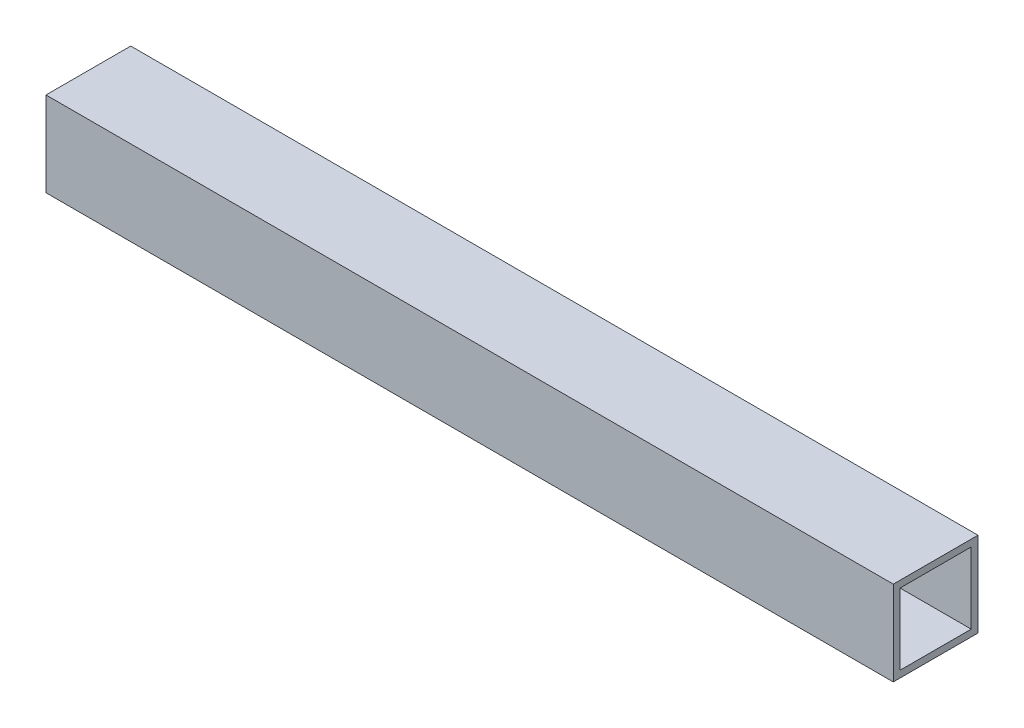
ISO-10303-21;
HEADER;
FILE_DESCRIPTION(('STEP AP214'),'2;1');
FILE_NAME('part.step','',(''),(''),'','','');
FILE_SCHEMA(('AUTOMOTIVE_DESIGN { 1 0 10303 214 1 1 1 1 }'));
ENDSEC;
DATA;
#1=APPLICATION_CONTEXT('core data for automotive mechanical design processes');
#2=APPLICATION_PROTOCOL_DEFINITION('international standard','automotive_design',2000,#1);
#3=PRODUCT_CONTEXT('',#1,'mechanical');
#4=PRODUCT('Part','Part','',(#3));
#5=PRODUCT_RELATED_PRODUCT_CATEGORY('part','',(#4));
#6=PRODUCT_DEFINITION_FORMATION('','',#4);
#7=PRODUCT_DEFINITION_CONTEXT('part definition',#1,'design');
#8=PRODUCT_DEFINITION('design','',#6,#7);
#9=PRODUCT_DEFINITION_SHAPE('','',#8);
#10=(LENGTH_UNIT() NAMED_UNIT(*) SI_UNIT(.MILLI.,.METRE.));
#11=(NAMED_UNIT(*) PLANE_ANGLE_UNIT() SI_UNIT($,.RADIAN.));
#12=(NAMED_UNIT(*) SI_UNIT($,.STERADIAN.) SOLID_ANGLE_UNIT());
#13=UNCERTAINTY_MEASURE_WITH_UNIT(LENGTH_MEASURE(1.E-05),#10,'distance_accuracy_value','');
#14=(GEOMETRIC_REPRESENTATION_CONTEXT(3) GLOBAL_UNCERTAINTY_ASSIGNED_CONTEXT((#13)) GLOBAL_UNIT_ASSIGNED_CONTEXT((#10,
#11,#12)) REPRESENTATION_CONTEXT('',''));
#15=CARTESIAN_POINT('',(0.,0.,0.));
#16=DIRECTION('',(0.,0.,1.));
#17=DIRECTION('',(1.,0.,0.));
#18=AXIS2_PLACEMENT_3D('',#15,#16,#17);
#19=CARTESIAN_POINT('',(99.9999999999993,-80.0000000000005,-559.054711762656));
#20=DIRECTION('',(1.,0.,0.));
#21=DIRECTION('',(0.,0.,-1.));
#22=AXIS2_PLACEMENT_3D('',#19,#20,#21);
#23=PLANE('',#22);
#24=DIRECTION('',(0.,1.,0.));
#25=VECTOR('',#24,1.);
#26=CARTESIAN_POINT('',(99.9999999999993,-90.,-560.));
#27=LINE('',#26,#25);
#28=CARTESIAN_POINT('',(99.9999999999993,-90.0000000000005,-560.));
#29=VERTEX_POINT('',#28);
#30=CARTESIAN_POINT('',(99.9999999999993,-70.0000000000005,-560.));
#31=VERTEX_POINT('',#30);
#32=EDGE_CURVE('E142',#29,#31,#27,.T.);
#33=ORIENTED_EDGE('',*,*,#32,.T.);
#34=DIRECTION('',(0.,0.,1.));
#35=VECTOR('',#34,1.);
#36=CARTESIAN_POINT('',(99.9999999999993,-70.,-540.));
#37=LINE('',#36,#35);
#38=CARTESIAN_POINT('',(99.9999999999993,-70.,-540.));
#39=VERTEX_POINT('',#38);
#40=EDGE_CURVE('E86',#31,#39,#37,.T.);
#41=ORIENTED_EDGE('',*,*,#40,.T.);
#42=DIRECTION('',(0.,-1.,0.));
#43=VECTOR('',#42,1.);
#44=CARTESIAN_POINT('',(99.9999999999993,-90.,-540.));
#45=LINE('',#44,#43);
#46=CARTESIAN_POINT('',(99.9999999999993,-90.,-540.));
#47=VERTEX_POINT('',#46);
#48=EDGE_CURVE('E146',#39,#47,#45,.T.);
#49=ORIENTED_EDGE('',*,*,#48,.T.);
#50=DIRECTION('',(0.,0.,-1.));
#51=VECTOR('',#50,1.);
#52=CARTESIAN_POINT('',(99.9999999999993,-90.,-540.));
#53=LINE('',#52,#51);
#54=EDGE_CURVE('E140',#47,#29,#53,.T.);
#55=ORIENTED_EDGE('',*,*,#54,.T.);
#56=EDGE_LOOP('',(#33,#41,#49,#55));
#57=FACE_BOUND('',#56,.T.);
#58=DIRECTION('',(0.,0.,-1.));
#59=VECTOR('',#58,1.);
#60=CARTESIAN_POINT('',(99.9999999999993,-88.3999999999999,-541.6));
#61=LINE('',#60,#59);
#62=CARTESIAN_POINT('',(99.9999999999993,-88.3999999999999,-541.6));
#63=VERTEX_POINT('',#62);
#64=CARTESIAN_POINT('',(99.9999999999993,-88.4,-558.4));
#65=VERTEX_POINT('',#64);
#66=EDGE_CURVE('E50',#63,#65,#61,.T.);
#67=ORIENTED_EDGE('',*,*,#66,.F.);
#68=DIRECTION('',(0.,-1.,0.));
#69=VECTOR('',#68,1.);
#70=CARTESIAN_POINT('',(99.9999999999993,-88.3999999999999,-541.6));
#71=LINE('',#70,#69);
#72=CARTESIAN_POINT('',(99.9999999999993,-71.6,-541.6));
#73=VERTEX_POINT('',#72);
#74=EDGE_CURVE('E137',#73,#63,#71,.T.);
#75=ORIENTED_EDGE('',*,*,#74,.F.);
#76=DIRECTION('',(0.,0.,1.));
#77=VECTOR('',#76,1.);
#78=CARTESIAN_POINT('',(99.9999999999993,-71.6,-541.6));
#79=LINE('',#78,#77);
#80=CARTESIAN_POINT('',(99.9999999999993,-71.6,-558.4));
#81=VERTEX_POINT('',#80);
#82=EDGE_CURVE('E134',#81,#73,#79,.T.);
#83=ORIENTED_EDGE('',*,*,#82,.F.);
#84=DIRECTION('',(0.,1.,0.));
#85=VECTOR('',#84,1.);
#86=CARTESIAN_POINT('',(99.9999999999993,-88.4,-558.4));
#87=LINE('',#86,#85);
#88=EDGE_CURVE('E119',#65,#81,#87,.T.);
#89=ORIENTED_EDGE('',*,*,#88,.F.);
#90=EDGE_LOOP('',(#67,#75,#83,#89));
#91=FACE_BOUND('',#90,.T.);
#92=ADVANCED_FACE('F41',(#57,#91),#23,.T.);
#93=CARTESIAN_POINT('',(-100.,-90.0000000000004,-550.));
#94=DIRECTION('',(-1.,0.,0.));
#95=DIRECTION('',(0.,0.,1.));
#96=AXIS2_PLACEMENT_3D('',#93,#94,#95);
#97=PLANE('',#96);
#98=DIRECTION('',(0.,1.,0.));
#99=VECTOR('',#98,1.);
#100=CARTESIAN_POINT('',(-100.,-88.3999999999999,-541.6));
#101=LINE('',#100,#99);
#102=CARTESIAN_POINT('',(-100.,-88.3999999999999,-541.6));
#103=VERTEX_POINT('',#102);
#104=CARTESIAN_POINT('',(-100.,-71.6,-541.6));
#105=VERTEX_POINT('',#104);
#106=EDGE_CURVE('E111',#103,#105,#101,.T.);
#107=ORIENTED_EDGE('',*,*,#106,.F.);
#108=DIRECTION('',(0.,0.,1.));
#109=VECTOR('',#108,1.);
#110=CARTESIAN_POINT('',(-100.,-88.3999999999999,-541.6));
#111=LINE('',#110,#109);
#112=CARTESIAN_POINT('',(-100.,-88.4,-558.4));
#113=VERTEX_POINT('',#112);
#114=EDGE_CURVE('E11',#113,#103,#111,.T.);
#115=ORIENTED_EDGE('',*,*,#114,.F.);
#116=DIRECTION('',(0.,-1.,0.));
#117=VECTOR('',#116,1.);
#118=CARTESIAN_POINT('',(-100.,-88.4,-558.4));
#119=LINE('',#118,#117);
#120=CARTESIAN_POINT('',(-100.,-71.6,-558.4));
#121=VERTEX_POINT('',#120);
#122=EDGE_CURVE('E109',#121,#113,#119,.T.);
#123=ORIENTED_EDGE('',*,*,#122,.F.);
#124=DIRECTION('',(0.,0.,-1.));
#125=VECTOR('',#124,1.);
#126=CARTESIAN_POINT('',(-100.,-71.6,-541.6));
#127=LINE('',#126,#125);
#128=EDGE_CURVE('E132',#105,#121,#127,.T.);
#129=ORIENTED_EDGE('',*,*,#128,.F.);
#130=EDGE_LOOP('',(#107,#115,#123,#129));
#131=FACE_BOUND('',#130,.T.);
#132=DIRECTION('',(0.,-1.,0.));
#133=VECTOR('',#132,1.);
#134=CARTESIAN_POINT('',(-100.,-90.,-560.));
#135=LINE('',#134,#133);
#136=CARTESIAN_POINT('',(-100.,-70.0000000000004,-560.));
#137=VERTEX_POINT('',#136);
#138=CARTESIAN_POINT('',(-100.,-90.0000000000004,-560.));
#139=VERTEX_POINT('',#138);
#140=EDGE_CURVE('E138',#137,#139,#135,.T.);
#141=ORIENTED_EDGE('',*,*,#140,.T.);
#142=DIRECTION('',(0.,0.,1.));
#143=VECTOR('',#142,1.);
#144=CARTESIAN_POINT('',(-100.,-90.,-540.));
#145=LINE('',#144,#143);
#146=CARTESIAN_POINT('',(-100.,-90.,-540.));
#147=VERTEX_POINT('',#146);
#148=EDGE_CURVE('E126',#139,#147,#145,.T.);
#149=ORIENTED_EDGE('',*,*,#148,.T.);
#150=DIRECTION('',(0.,1.,0.));
#151=VECTOR('',#150,1.);
#152=CARTESIAN_POINT('',(-100.,-90.,-540.));
#153=LINE('',#152,#151);
#154=CARTESIAN_POINT('',(-100.,-70.,-540.));
#155=VERTEX_POINT('',#154);
#156=EDGE_CURVE('E124',#147,#155,#153,.T.);
#157=ORIENTED_EDGE('',*,*,#156,.T.);
#158=DIRECTION('',(0.,0.,-1.));
#159=VECTOR('',#158,1.);
#160=CARTESIAN_POINT('',(-100.,-70.0000000000004,-550.));
#161=LINE('',#160,#159);
#162=EDGE_CURVE('E93',#155,#137,#161,.T.);
#163=ORIENTED_EDGE('',*,*,#162,.T.);
#164=EDGE_LOOP('',(#141,#149,#157,#163));
#165=FACE_BOUND('',#164,.T.);
#166=ADVANCED_FACE('F107',(#131,#165),#97,.T.);
#167=CARTESIAN_POINT('',(-110.,-88.4,-558.4));
#168=DIRECTION('',(0.,0.,1.));
#169=DIRECTION('',(1.,0.,0.));
#170=AXIS2_PLACEMENT_3D('',#167,#168,#169);
#171=PLANE('',#170);
#172=DIRECTION('',(1.,0.,0.));
#173=VECTOR('',#172,1.);
#174=CARTESIAN_POINT('',(-110.,-88.4,-558.4));
#175=LINE('',#174,#173);
#176=EDGE_CURVE('E44',#113,#65,#175,.T.);
#177=ORIENTED_EDGE('',*,*,#176,.T.);
#178=ORIENTED_EDGE('',*,*,#88,.T.);
#179=DIRECTION('',(1.,0.,0.));
#180=VECTOR('',#179,1.);
#181=CARTESIAN_POINT('',(-110.,-71.6,-558.4));
#182=LINE('',#181,#180);
#183=EDGE_CURVE('E117',#121,#81,#182,.T.);
#184=ORIENTED_EDGE('',*,*,#183,.F.);
#185=ORIENTED_EDGE('',*,*,#122,.T.);
#186=EDGE_LOOP('',(#177,#178,#184,#185));
#187=FACE_BOUND('',#186,.T.);
#188=ADVANCED_FACE('F114',(#187),#171,.T.);
#189=CARTESIAN_POINT('',(-110.,-90.,-560.));
#190=DIRECTION('',(0.,0.,1.));
#191=DIRECTION('',(1.,0.,0.));
#192=AXIS2_PLACEMENT_3D('',#189,#190,#191);
#193=PLANE('',#192);
#194=ORIENTED_EDGE('',*,*,#32,.F.);
#195=DIRECTION('',(1.,0.,0.));
#196=VECTOR('',#195,1.);
#197=CARTESIAN_POINT('',(-110.,-90.,-560.));
#198=LINE('',#197,#196);
#199=EDGE_CURVE('E136',#139,#29,#198,.T.);
#200=ORIENTED_EDGE('',*,*,#199,.F.);
#201=ORIENTED_EDGE('',*,*,#140,.F.);
#202=DIRECTION('',(1.,0.,0.));
#203=VECTOR('',#202,1.);
#204=CARTESIAN_POINT('',(-110.,-70.,-560.));
#205=LINE('',#204,#203);
#206=EDGE_CURVE('E118',#137,#31,#205,.T.);
#207=ORIENTED_EDGE('',*,*,#206,.T.);
#208=EDGE_LOOP('',(#194,#200,#201,#207));
#209=FACE_BOUND('',#208,.T.);
#210=ADVANCED_FACE('F168',(#209),#193,.F.);
#211=CARTESIAN_POINT('',(-110.,-71.6,-541.6));
#212=DIRECTION('',(0.,-1.,0.));
#213=DIRECTION('',(0.,0.,-1.));
#214=AXIS2_PLACEMENT_3D('',#211,#212,#213);
#215=PLANE('',#214);
#216=ORIENTED_EDGE('',*,*,#82,.T.);
#217=DIRECTION('',(1.,0.,0.));
#218=VECTOR('',#217,1.);
#219=CARTESIAN_POINT('',(-110.,-71.6,-541.6));
#220=LINE('',#219,#218);
#221=EDGE_CURVE('E152',#105,#73,#220,.T.);
#222=ORIENTED_EDGE('',*,*,#221,.F.);
#223=ORIENTED_EDGE('',*,*,#128,.T.);
#224=ORIENTED_EDGE('',*,*,#183,.T.);
#225=EDGE_LOOP('',(#216,#222,#223,#224));
#226=FACE_BOUND('',#225,.T.);
#227=ADVANCED_FACE('F187',(#226),#215,.T.);
#228=CARTESIAN_POINT('',(-110.,-88.3999999999999,-541.6));
#229=DIRECTION('',(0.,0.,-1.));
#230=DIRECTION('',(-1.,0.,0.));
#231=AXIS2_PLACEMENT_3D('',#228,#229,#230);
#232=PLANE('',#231);
#233=ORIENTED_EDGE('',*,*,#221,.T.);
#234=ORIENTED_EDGE('',*,*,#74,.T.);
#235=DIRECTION('',(1.,0.,0.));
#236=VECTOR('',#235,1.);
#237=CARTESIAN_POINT('',(-110.,-88.3999999999999,-541.6));
#238=LINE('',#237,#236);
#239=EDGE_CURVE('E154',#103,#63,#238,.T.);
#240=ORIENTED_EDGE('',*,*,#239,.F.);
#241=ORIENTED_EDGE('',*,*,#106,.T.);
#242=EDGE_LOOP('',(#233,#234,#240,#241));
#243=FACE_BOUND('',#242,.T.);
#244=ADVANCED_FACE('F188',(#243),#232,.T.);
#245=CARTESIAN_POINT('',(-110.,-90.,-540.));
#246=DIRECTION('',(0.,1.,0.));
#247=DIRECTION('',(0.,0.,1.));
#248=AXIS2_PLACEMENT_3D('',#245,#246,#247);
#249=PLANE('',#248);
#250=ORIENTED_EDGE('',*,*,#54,.F.);
#251=DIRECTION('',(1.,0.,0.));
#252=VECTOR('',#251,1.);
#253=CARTESIAN_POINT('',(-110.,-90.,-540.));
#254=LINE('',#253,#252);
#255=EDGE_CURVE('E160',#147,#47,#254,.T.);
#256=ORIENTED_EDGE('',*,*,#255,.F.);
#257=ORIENTED_EDGE('',*,*,#148,.F.);
#258=ORIENTED_EDGE('',*,*,#199,.T.);
#259=EDGE_LOOP('',(#250,#256,#257,#258));
#260=FACE_BOUND('',#259,.T.);
#261=ADVANCED_FACE('F209',(#260),#249,.F.);
#262=CARTESIAN_POINT('',(-110.,-90.,-540.));
#263=DIRECTION('',(0.,0.,-1.));
#264=DIRECTION('',(-1.,0.,0.));
#265=AXIS2_PLACEMENT_3D('',#262,#263,#264);
#266=PLANE('',#265);
#267=ORIENTED_EDGE('',*,*,#48,.F.);
#268=DIRECTION('',(1.,0.,0.));
#269=VECTOR('',#268,1.);
#270=CARTESIAN_POINT('',(-110.,-70.,-540.));
#271=LINE('',#270,#269);
#272=EDGE_CURVE('E163',#155,#39,#271,.T.);
#273=ORIENTED_EDGE('',*,*,#272,.F.);
#274=ORIENTED_EDGE('',*,*,#156,.F.);
#275=ORIENTED_EDGE('',*,*,#255,.T.);
#276=EDGE_LOOP('',(#267,#273,#274,#275));
#277=FACE_BOUND('',#276,.T.);
#278=ADVANCED_FACE('F174',(#277),#266,.F.);
#279=CARTESIAN_POINT('',(-110.,-70.,-540.));
#280=DIRECTION('',(0.,-1.,0.));
#281=DIRECTION('',(0.,0.,-1.));
#282=AXIS2_PLACEMENT_3D('',#279,#280,#281);
#283=PLANE('',#282);
#284=ORIENTED_EDGE('',*,*,#40,.F.);
#285=ORIENTED_EDGE('',*,*,#206,.F.);
#286=ORIENTED_EDGE('',*,*,#162,.F.);
#287=ORIENTED_EDGE('',*,*,#272,.T.);
#288=EDGE_LOOP('',(#284,#285,#286,#287));
#289=FACE_BOUND('',#288,.T.);
#290=ADVANCED_FACE('F170',(#289),#283,.F.);
#291=CARTESIAN_POINT('',(-110.,-88.3999999999999,-541.6));
#292=DIRECTION('',(0.,1.,0.));
#293=DIRECTION('',(0.,0.,1.));
#294=AXIS2_PLACEMENT_3D('',#291,#292,#293);
#295=PLANE('',#294);
#296=ORIENTED_EDGE('',*,*,#239,.T.);
#297=ORIENTED_EDGE('',*,*,#66,.T.);
#298=ORIENTED_EDGE('',*,*,#176,.F.);
#299=ORIENTED_EDGE('',*,*,#114,.T.);
#300=EDGE_LOOP('',(#296,#297,#298,#299));
#301=FACE_BOUND('',#300,.T.);
#302=ADVANCED_FACE('F121',(#301),#295,.T.);
#303=CLOSED_SHELL('',(#92,#166,#188,#210,#227,#244,#261,#278,#290,#302));
#304=MANIFOLD_SOLID_BREP('B2',#303);
#305=ADVANCED_BREP_SHAPE_REPRESENTATION('',(#18,#304),#14);
#306=SHAPE_DEFINITION_REPRESENTATION(#9,#305);
ENDSEC;
END-ISO-10303-21;
